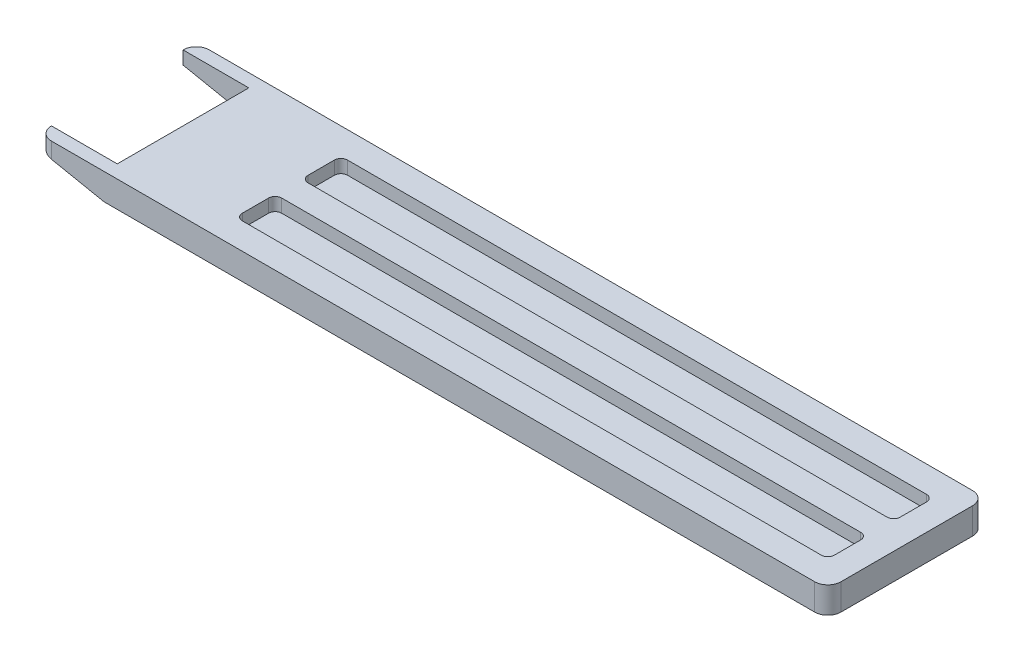
ISO-10303-21;
HEADER;
FILE_DESCRIPTION(('STEP AP214'),'2;1');
FILE_NAME('part.step','',(''),(''),'','','');
FILE_SCHEMA(('AUTOMOTIVE_DESIGN { 1 0 10303 214 1 1 1 1 }'));
ENDSEC;
DATA;
#1=APPLICATION_CONTEXT('core data for automotive mechanical design processes');
#2=APPLICATION_PROTOCOL_DEFINITION('international standard','automotive_design',2000,#1);
#3=PRODUCT_CONTEXT('',#1,'mechanical');
#4=PRODUCT('Part','Part','',(#3));
#5=PRODUCT_RELATED_PRODUCT_CATEGORY('part','',(#4));
#6=PRODUCT_DEFINITION_FORMATION('','',#4);
#7=PRODUCT_DEFINITION_CONTEXT('part definition',#1,'design');
#8=PRODUCT_DEFINITION('design','',#6,#7);
#9=PRODUCT_DEFINITION_SHAPE('','',#8);
#10=(LENGTH_UNIT() NAMED_UNIT(*) SI_UNIT(.MILLI.,.METRE.));
#11=(NAMED_UNIT(*) PLANE_ANGLE_UNIT() SI_UNIT($,.RADIAN.));
#12=(NAMED_UNIT(*) SI_UNIT($,.STERADIAN.) SOLID_ANGLE_UNIT());
#13=UNCERTAINTY_MEASURE_WITH_UNIT(LENGTH_MEASURE(1.E-05),#10,'distance_accuracy_value','');
#14=(GEOMETRIC_REPRESENTATION_CONTEXT(3) GLOBAL_UNCERTAINTY_ASSIGNED_CONTEXT((#13)) GLOBAL_UNIT_ASSIGNED_CONTEXT((#10,
#11,#12)) REPRESENTATION_CONTEXT('',''));
#15=CARTESIAN_POINT('',(0.,0.,0.));
#16=DIRECTION('',(0.,0.,1.));
#17=DIRECTION('',(1.,0.,0.));
#18=AXIS2_PLACEMENT_3D('',#15,#16,#17);
#19=CARTESIAN_POINT('',(-300.,10.,-60.001));
#20=DIRECTION('',(0.196116135138184,0.98058067569092,0.));
#21=DIRECTION('',(-0.98058067569092,0.196116135138184,0.));
#22=AXIS2_PLACEMENT_3D('',#19,#20,#21);
#23=PLANE('',#22);
#24=DIRECTION('',(0.,0.,1.));
#25=VECTOR('',#24,1.);
#26=CARTESIAN_POINT('',(-250.,0.,-60.001));
#27=LINE('',#26,#25);
#28=CARTESIAN_POINT('',(-250.,0.,-60.));
#29=VERTEX_POINT('',#28);
#30=CARTESIAN_POINT('',(-250.,0.,-50.));
#31=VERTEX_POINT('',#30);
#32=EDGE_CURVE('E404',#29,#31,#27,.T.);
#33=ORIENTED_EDGE('',*,*,#32,.T.);
#34=DIRECTION('',(0.98058067569092,-0.196116135138184,0.));
#35=VECTOR('',#34,1.);
#36=CARTESIAN_POINT('',(-298.076730769231,9.61534615384615,-49.9999999999999));
#37=LINE('',#36,#35);
#38=CARTESIAN_POINT('',(-300.,10.,-49.9999999999999));
#39=VERTEX_POINT('',#38);
#40=EDGE_CURVE('E237',#39,#31,#37,.T.);
#41=ORIENTED_EDGE('',*,*,#40,.F.);
#42=CARTESIAN_POINT('',(-290.,8.,-50.));
#43=DIRECTION('',(0.196116135138184,0.98058067569092,0.));
#44=DIRECTION('',(0.98058067569092,-0.196116135138184,0.));
#45=AXIS2_PLACEMENT_3D('',#42,#43,#44);
#46=ELLIPSE('',#45,10.1980390271856,10.);
#47=CARTESIAN_POINT('',(-290.,8.,-60.));
#48=VERTEX_POINT('',#47);
#49=EDGE_CURVE('E425',#39,#48,#46,.F.);
#50=ORIENTED_EDGE('',*,*,#49,.T.);
#51=DIRECTION('',(0.98058067569092,-0.196116135138184,0.));
#52=VECTOR('',#51,1.);
#53=CARTESIAN_POINT('',(-300.,10.,-60.));
#54=LINE('',#53,#52);
#55=EDGE_CURVE('E368',#48,#29,#54,.T.);
#56=ORIENTED_EDGE('',*,*,#55,.T.);
#57=EDGE_LOOP('',(#33,#41,#50,#56));
#58=FACE_BOUND('',#57,.T.);
#59=ADVANCED_FACE('F36',(#58),#23,.F.);
#60=CARTESIAN_POINT('',(300.,20.,60.));
#61=DIRECTION('',(0.,0.,-1.));
#62=DIRECTION('',(-1.,0.,0.));
#63=AXIS2_PLACEMENT_3D('',#60,#61,#62);
#64=PLANE('',#63);
#65=DIRECTION('',(1.,0.,0.));
#66=VECTOR('',#65,1.);
#67=CARTESIAN_POINT('',(300.,20.,60.));
#68=LINE('',#67,#66);
#69=CARTESIAN_POINT('',(-290.,20.,60.));
#70=VERTEX_POINT('',#69);
#71=CARTESIAN_POINT('',(290.,20.,60.));
#72=VERTEX_POINT('',#71);
#73=EDGE_CURVE('E408',#70,#72,#68,.T.);
#74=ORIENTED_EDGE('',*,*,#73,.F.);
#75=DIRECTION('',(0.,-1.,0.));
#76=VECTOR('',#75,1.);
#77=CARTESIAN_POINT('',(-290.,20.,60.));
#78=LINE('',#77,#76);
#79=CARTESIAN_POINT('',(-290.,8.,60.));
#80=VERTEX_POINT('',#79);
#81=EDGE_CURVE('E242',#70,#80,#78,.T.);
#82=ORIENTED_EDGE('',*,*,#81,.T.);
#83=DIRECTION('',(-0.98058067569092,0.196116135138184,0.));
#84=VECTOR('',#83,1.);
#85=CARTESIAN_POINT('',(-300.,10.,60.));
#86=LINE('',#85,#84);
#87=CARTESIAN_POINT('',(-250.,0.,60.));
#88=VERTEX_POINT('',#87);
#89=EDGE_CURVE('E400',#88,#80,#86,.T.);
#90=ORIENTED_EDGE('',*,*,#89,.F.);
#91=DIRECTION('',(1.,0.,0.));
#92=VECTOR('',#91,1.);
#93=CARTESIAN_POINT('',(300.,0.,60.));
#94=LINE('',#93,#92);
#95=CARTESIAN_POINT('',(290.,0.,60.));
#96=VERTEX_POINT('',#95);
#97=EDGE_CURVE('E407',#88,#96,#94,.T.);
#98=ORIENTED_EDGE('',*,*,#97,.T.);
#99=DIRECTION('',(0.,-1.,0.));
#100=VECTOR('',#99,1.);
#101=CARTESIAN_POINT('',(290.,20.,60.));
#102=LINE('',#101,#100);
#103=EDGE_CURVE('E247',#96,#72,#102,.F.);
#104=ORIENTED_EDGE('',*,*,#103,.T.);
#105=EDGE_LOOP('',(#74,#82,#90,#98,#104));
#106=FACE_BOUND('',#105,.T.);
#107=ADVANCED_FACE('F449',(#106),#64,.F.);
#108=CARTESIAN_POINT('',(300.,20.,60.));
#109=DIRECTION('',(-1.,0.,0.));
#110=DIRECTION('',(0.,0.,1.));
#111=AXIS2_PLACEMENT_3D('',#108,#109,#110);
#112=PLANE('',#111);
#113=DIRECTION('',(0.,0.,-1.));
#114=VECTOR('',#113,1.);
#115=CARTESIAN_POINT('',(300.,0.,60.));
#116=LINE('',#115,#114);
#117=CARTESIAN_POINT('',(300.,0.,50.));
#118=VERTEX_POINT('',#117);
#119=CARTESIAN_POINT('',(300.,0.,-50.));
#120=VERTEX_POINT('',#119);
#121=EDGE_CURVE('E418',#118,#120,#116,.T.);
#122=ORIENTED_EDGE('',*,*,#121,.T.);
#123=DIRECTION('',(0.,-1.,0.));
#124=VECTOR('',#123,1.);
#125=CARTESIAN_POINT('',(300.,20.,-50.));
#126=LINE('',#125,#124);
#127=CARTESIAN_POINT('',(300.,20.,-50.));
#128=VERTEX_POINT('',#127);
#129=EDGE_CURVE('E262',#120,#128,#126,.F.);
#130=ORIENTED_EDGE('',*,*,#129,.T.);
#131=DIRECTION('',(0.,0.,-1.));
#132=VECTOR('',#131,1.);
#133=CARTESIAN_POINT('',(300.,20.,60.));
#134=LINE('',#133,#132);
#135=CARTESIAN_POINT('',(300.,20.,50.));
#136=VERTEX_POINT('',#135);
#137=EDGE_CURVE('E410',#136,#128,#134,.T.);
#138=ORIENTED_EDGE('',*,*,#137,.F.);
#139=DIRECTION('',(0.,-1.,0.));
#140=VECTOR('',#139,1.);
#141=CARTESIAN_POINT('',(300.,20.,50.));
#142=LINE('',#141,#140);
#143=EDGE_CURVE('E259',#136,#118,#142,.T.);
#144=ORIENTED_EDGE('',*,*,#143,.T.);
#145=EDGE_LOOP('',(#122,#130,#138,#144));
#146=FACE_BOUND('',#145,.T.);
#147=ADVANCED_FACE('F438',(#146),#112,.F.);
#148=CARTESIAN_POINT('',(300.,20.,-60.));
#149=DIRECTION('',(0.,0.,1.));
#150=DIRECTION('',(1.,0.,0.));
#151=AXIS2_PLACEMENT_3D('',#148,#149,#150);
#152=PLANE('',#151);
#153=ORIENTED_EDGE('',*,*,#55,.F.);
#154=DIRECTION('',(0.,-1.,0.));
#155=VECTOR('',#154,1.);
#156=CARTESIAN_POINT('',(-290.,20.,-60.));
#157=LINE('',#156,#155);
#158=CARTESIAN_POINT('',(-290.,20.,-60.));
#159=VERTEX_POINT('',#158);
#160=EDGE_CURVE('E430',#48,#159,#157,.F.);
#161=ORIENTED_EDGE('',*,*,#160,.T.);
#162=DIRECTION('',(-1.,0.,0.));
#163=VECTOR('',#162,1.);
#164=CARTESIAN_POINT('',(300.,20.,-60.));
#165=LINE('',#164,#163);
#166=CARTESIAN_POINT('',(290.,20.,-60.));
#167=VERTEX_POINT('',#166);
#168=EDGE_CURVE('E226',#167,#159,#165,.T.);
#169=ORIENTED_EDGE('',*,*,#168,.F.);
#170=DIRECTION('',(0.,-1.,0.));
#171=VECTOR('',#170,1.);
#172=CARTESIAN_POINT('',(290.,20.,-60.));
#173=LINE('',#172,#171);
#174=CARTESIAN_POINT('',(290.,0.,-60.));
#175=VERTEX_POINT('',#174);
#176=EDGE_CURVE('E427',#167,#175,#173,.T.);
#177=ORIENTED_EDGE('',*,*,#176,.T.);
#178=DIRECTION('',(-1.,0.,0.));
#179=VECTOR('',#178,1.);
#180=CARTESIAN_POINT('',(300.,0.,-60.));
#181=LINE('',#180,#179);
#182=EDGE_CURVE('E411',#175,#29,#181,.T.);
#183=ORIENTED_EDGE('',*,*,#182,.T.);
#184=EDGE_LOOP('',(#153,#161,#169,#177,#183));
#185=FACE_BOUND('',#184,.T.);
#186=ADVANCED_FACE('F465',(#185),#152,.F.);
#187=CARTESIAN_POINT('',(0.,20.,0.));
#188=DIRECTION('',(0.,1.,0.));
#189=DIRECTION('',(0.,0.,1.));
#190=AXIS2_PLACEMENT_3D('',#187,#188,#189);
#191=PLANE('',#190);
#192=DIRECTION('',(-1.,0.,0.));
#193=VECTOR('',#192,1.);
#194=CARTESIAN_POINT('',(-300.,20.,-49.9999999999999));
#195=LINE('',#194,#193);
#196=CARTESIAN_POINT('',(-250.,20.,-50.));
#197=VERTEX_POINT('',#196);
#198=CARTESIAN_POINT('',(-300.,20.,-49.9999999999999));
#199=VERTEX_POINT('',#198);
#200=EDGE_CURVE('E471',#197,#199,#195,.T.);
#201=ORIENTED_EDGE('',*,*,#200,.F.);
#202=DIRECTION('',(0.,0.,-1.));
#203=VECTOR('',#202,1.);
#204=CARTESIAN_POINT('',(-250.,20.,-50.));
#205=LINE('',#204,#203);
#206=CARTESIAN_POINT('',(-250.,20.,50.0000000000001));
#207=VERTEX_POINT('',#206);
#208=EDGE_CURVE('E236',#207,#197,#205,.T.);
#209=ORIENTED_EDGE('',*,*,#208,.F.);
#210=DIRECTION('',(1.,0.,0.));
#211=VECTOR('',#210,1.);
#212=CARTESIAN_POINT('',(-300.,20.,50.));
#213=LINE('',#212,#211);
#214=CARTESIAN_POINT('',(-300.,20.,50.));
#215=VERTEX_POINT('',#214);
#216=EDGE_CURVE('E218',#215,#207,#213,.T.);
#217=ORIENTED_EDGE('',*,*,#216,.F.);
#218=CARTESIAN_POINT('',(-290.,20.,50.));
#219=DIRECTION('',(0.,1.,0.));
#220=DIRECTION('',(0.,0.,1.));
#221=AXIS2_PLACEMENT_3D('',#218,#219,#220);
#222=CIRCLE('',#221,10.);
#223=EDGE_CURVE('E233',#215,#70,#222,.T.);
#224=ORIENTED_EDGE('',*,*,#223,.T.);
#225=ORIENTED_EDGE('',*,*,#73,.T.);
#226=CARTESIAN_POINT('',(290.,20.,50.));
#227=DIRECTION('',(0.,1.,0.));
#228=DIRECTION('',(0.,0.,1.));
#229=AXIS2_PLACEMENT_3D('',#226,#227,#228);
#230=CIRCLE('',#229,10.);
#231=EDGE_CURVE('E249',#72,#136,#230,.T.);
#232=ORIENTED_EDGE('',*,*,#231,.T.);
#233=ORIENTED_EDGE('',*,*,#137,.T.);
#234=CARTESIAN_POINT('',(290.,20.,-50.));
#235=DIRECTION('',(0.,1.,0.));
#236=DIRECTION('',(0.,0.,1.));
#237=AXIS2_PLACEMENT_3D('',#234,#235,#236);
#238=CIRCLE('',#237,10.);
#239=EDGE_CURVE('E244',#128,#167,#238,.T.);
#240=ORIENTED_EDGE('',*,*,#239,.T.);
#241=ORIENTED_EDGE('',*,*,#168,.T.);
#242=CARTESIAN_POINT('',(-290.,20.,-50.));
#243=DIRECTION('',(0.,1.,0.));
#244=DIRECTION('',(0.,0.,1.));
#245=AXIS2_PLACEMENT_3D('',#242,#243,#244);
#246=CIRCLE('',#245,10.);
#247=EDGE_CURVE('E243',#159,#199,#246,.T.);
#248=ORIENTED_EDGE('',*,*,#247,.T.);
#249=EDGE_LOOP('',(#201,#209,#217,#224,#225,#232,#233,#240,#241,#248));
#250=FACE_BOUND('',#249,.T.);
#251=DIRECTION('',(0.,0.,1.));
#252=VECTOR('',#251,1.);
#253=CARTESIAN_POINT('',(-170.,20.,-40.));
#254=LINE('',#253,#252);
#255=CARTESIAN_POINT('',(-170.,20.,-35.));
#256=VERTEX_POINT('',#255);
#257=CARTESIAN_POINT('',(-170.,20.,-15.));
#258=VERTEX_POINT('',#257);
#259=EDGE_CURVE('E334',#256,#258,#254,.T.);
#260=ORIENTED_EDGE('',*,*,#259,.F.);
#261=CARTESIAN_POINT('',(-165.,20.,-35.));
#262=DIRECTION('',(0.,1.,0.));
#263=DIRECTION('',(0.,0.,1.));
#264=AXIS2_PLACEMENT_3D('',#261,#262,#263);
#265=CIRCLE('',#264,5.);
#266=CARTESIAN_POINT('',(-165.,20.,-40.));
#267=VERTEX_POINT('',#266);
#268=EDGE_CURVE('E44',#256,#267,#265,.F.);
#269=ORIENTED_EDGE('',*,*,#268,.T.);
#270=DIRECTION('',(-1.,0.,0.));
#271=VECTOR('',#270,1.);
#272=CARTESIAN_POINT('',(-170.,20.,-40.));
#273=LINE('',#272,#271);
#274=CARTESIAN_POINT('',(275.,20.,-40.));
#275=VERTEX_POINT('',#274);
#276=EDGE_CURVE('E332',#275,#267,#273,.T.);
#277=ORIENTED_EDGE('',*,*,#276,.F.);
#278=CARTESIAN_POINT('',(275.,20.,-35.));
#279=DIRECTION('',(0.,1.,0.));
#280=DIRECTION('',(0.,0.,1.));
#281=AXIS2_PLACEMENT_3D('',#278,#279,#280);
#282=CIRCLE('',#281,5.);
#283=CARTESIAN_POINT('',(280.,20.,-35.));
#284=VERTEX_POINT('',#283);
#285=EDGE_CURVE('E325',#275,#284,#282,.F.);
#286=ORIENTED_EDGE('',*,*,#285,.T.);
#287=DIRECTION('',(0.,0.,-1.));
#288=VECTOR('',#287,1.);
#289=CARTESIAN_POINT('',(280.,20.,-40.));
#290=LINE('',#289,#288);
#291=CARTESIAN_POINT('',(280.,20.,-15.));
#292=VERTEX_POINT('',#291);
#293=EDGE_CURVE('E344',#292,#284,#290,.T.);
#294=ORIENTED_EDGE('',*,*,#293,.F.);
#295=CARTESIAN_POINT('',(275.,20.,-15.));
#296=DIRECTION('',(0.,1.,0.));
#297=DIRECTION('',(0.,0.,1.));
#298=AXIS2_PLACEMENT_3D('',#295,#296,#297);
#299=CIRCLE('',#298,5.);
#300=CARTESIAN_POINT('',(275.,20.,-10.));
#301=VERTEX_POINT('',#300);
#302=EDGE_CURVE('E323',#292,#301,#299,.F.);
#303=ORIENTED_EDGE('',*,*,#302,.T.);
#304=DIRECTION('',(1.,0.,0.));
#305=VECTOR('',#304,1.);
#306=CARTESIAN_POINT('',(-170.,20.,-10.));
#307=LINE('',#306,#305);
#308=CARTESIAN_POINT('',(-165.,20.,-10.));
#309=VERTEX_POINT('',#308);
#310=EDGE_CURVE('E370',#309,#301,#307,.T.);
#311=ORIENTED_EDGE('',*,*,#310,.F.);
#312=CARTESIAN_POINT('',(-165.,20.,-15.));
#313=DIRECTION('',(0.,1.,0.));
#314=DIRECTION('',(0.,0.,1.));
#315=AXIS2_PLACEMENT_3D('',#312,#313,#314);
#316=CIRCLE('',#315,5.);
#317=EDGE_CURVE('E327',#309,#258,#316,.F.);
#318=ORIENTED_EDGE('',*,*,#317,.T.);
#319=EDGE_LOOP('',(#260,#269,#277,#286,#294,#303,#311,#318));
#320=FACE_BOUND('',#319,.T.);
#321=DIRECTION('',(0.,0.,1.));
#322=VECTOR('',#321,1.);
#323=CARTESIAN_POINT('',(-170.,20.,10.));
#324=LINE('',#323,#322);
#325=CARTESIAN_POINT('',(-170.,20.,15.0000000000001));
#326=VERTEX_POINT('',#325);
#327=CARTESIAN_POINT('',(-170.,20.,35.));
#328=VERTEX_POINT('',#327);
#329=EDGE_CURVE('E388',#326,#328,#324,.T.);
#330=ORIENTED_EDGE('',*,*,#329,.F.);
#331=CARTESIAN_POINT('',(-165.,20.,15.0000000000001));
#332=DIRECTION('',(0.,1.,0.));
#333=DIRECTION('',(0.,0.,1.));
#334=AXIS2_PLACEMENT_3D('',#331,#332,#333);
#335=CIRCLE('',#334,5.);
#336=CARTESIAN_POINT('',(-165.,20.,10.));
#337=VERTEX_POINT('',#336);
#338=EDGE_CURVE('E11',#326,#337,#335,.F.);
#339=ORIENTED_EDGE('',*,*,#338,.T.);
#340=DIRECTION('',(-1.,0.,0.));
#341=VECTOR('',#340,1.);
#342=CARTESIAN_POINT('',(-170.,20.,10.));
#343=LINE('',#342,#341);
#344=CARTESIAN_POINT('',(275.,20.,10.));
#345=VERTEX_POINT('',#344);
#346=EDGE_CURVE('E380',#345,#337,#343,.T.);
#347=ORIENTED_EDGE('',*,*,#346,.F.);
#348=CARTESIAN_POINT('',(275.,20.,15.0000000000001));
#349=DIRECTION('',(0.,1.,0.));
#350=DIRECTION('',(0.,0.,1.));
#351=AXIS2_PLACEMENT_3D('',#348,#349,#350);
#352=CIRCLE('',#351,5.);
#353=CARTESIAN_POINT('',(280.,20.,15.0000000000001));
#354=VERTEX_POINT('',#353);
#355=EDGE_CURVE('E319',#345,#354,#352,.F.);
#356=ORIENTED_EDGE('',*,*,#355,.T.);
#357=DIRECTION('',(0.,0.,-1.));
#358=VECTOR('',#357,1.);
#359=CARTESIAN_POINT('',(280.,20.,10.));
#360=LINE('',#359,#358);
#361=CARTESIAN_POINT('',(280.,20.,35.));
#362=VERTEX_POINT('',#361);
#363=EDGE_CURVE('E393',#362,#354,#360,.T.);
#364=ORIENTED_EDGE('',*,*,#363,.F.);
#365=CARTESIAN_POINT('',(275.,20.,35.));
#366=DIRECTION('',(0.,1.,0.));
#367=DIRECTION('',(0.,0.,1.));
#368=AXIS2_PLACEMENT_3D('',#365,#366,#367);
#369=CIRCLE('',#368,5.);
#370=CARTESIAN_POINT('',(275.,20.,40.));
#371=VERTEX_POINT('',#370);
#372=EDGE_CURVE('E321',#362,#371,#369,.F.);
#373=ORIENTED_EDGE('',*,*,#372,.T.);
#374=DIRECTION('',(1.,0.,0.));
#375=VECTOR('',#374,1.);
#376=CARTESIAN_POINT('',(-170.,20.,40.));
#377=LINE('',#376,#375);
#378=CARTESIAN_POINT('',(-165.,20.,40.));
#379=VERTEX_POINT('',#378);
#380=EDGE_CURVE('E390',#379,#371,#377,.T.);
#381=ORIENTED_EDGE('',*,*,#380,.F.);
#382=CARTESIAN_POINT('',(-165.,20.,35.));
#383=DIRECTION('',(0.,1.,0.));
#384=DIRECTION('',(0.,0.,1.));
#385=AXIS2_PLACEMENT_3D('',#382,#383,#384);
#386=CIRCLE('',#385,5.);
#387=EDGE_CURVE('E51',#379,#328,#386,.F.);
#388=ORIENTED_EDGE('',*,*,#387,.T.);
#389=EDGE_LOOP('',(#330,#339,#347,#356,#364,#373,#381,#388));
#390=FACE_BOUND('',#389,.T.);
#391=ADVANCED_FACE('F230',(#250,#320,#390),#191,.T.);
#392=CARTESIAN_POINT('',(0.,0.,0.));
#393=DIRECTION('',(0.,1.,0.));
#394=DIRECTION('',(0.,0.,1.));
#395=AXIS2_PLACEMENT_3D('',#392,#393,#394);
#396=PLANE('',#395);
#397=ORIENTED_EDGE('',*,*,#182,.F.);
#398=CARTESIAN_POINT('',(290.,0.,-50.));
#399=DIRECTION('',(0.,1.,0.));
#400=DIRECTION('',(0.,0.,1.));
#401=AXIS2_PLACEMENT_3D('',#398,#399,#400);
#402=CIRCLE('',#401,10.);
#403=EDGE_CURVE('E257',#175,#120,#402,.F.);
#404=ORIENTED_EDGE('',*,*,#403,.T.);
#405=ORIENTED_EDGE('',*,*,#121,.F.);
#406=CARTESIAN_POINT('',(290.,0.,50.));
#407=DIRECTION('',(0.,1.,0.));
#408=DIRECTION('',(0.,0.,1.));
#409=AXIS2_PLACEMENT_3D('',#406,#407,#408);
#410=CIRCLE('',#409,10.);
#411=EDGE_CURVE('E255',#118,#96,#410,.F.);
#412=ORIENTED_EDGE('',*,*,#411,.T.);
#413=ORIENTED_EDGE('',*,*,#97,.F.);
#414=CARTESIAN_POINT('',(-250.,0.,50.0000000000001));
#415=VERTEX_POINT('',#414);
#416=EDGE_CURVE('E403',#415,#88,#27,.T.);
#417=ORIENTED_EDGE('',*,*,#416,.F.);
#418=DIRECTION('',(0.,0.,1.));
#419=VECTOR('',#418,1.);
#420=CARTESIAN_POINT('',(-250.,0.,-60.001));
#421=LINE('',#420,#419);
#422=EDGE_CURVE('E455',#31,#415,#421,.T.);
#423=ORIENTED_EDGE('',*,*,#422,.F.);
#424=ORIENTED_EDGE('',*,*,#32,.F.);
#425=EDGE_LOOP('',(#397,#404,#405,#412,#413,#417,#423,#424));
#426=FACE_BOUND('',#425,.T.);
#427=ADVANCED_FACE('F445',(#426),#396,.F.);
#428=CARTESIAN_POINT('',(-290.,8.,50.));
#429=DIRECTION('',(0.196116135138184,0.98058067569092,0.));
#430=DIRECTION('',(0.98058067569092,-0.196116135138184,0.));
#431=AXIS2_PLACEMENT_3D('',#428,#429,#430);
#432=ELLIPSE('',#431,10.1980390271856,10.);
#433=CARTESIAN_POINT('',(-300.,10.,50.));
#434=VERTEX_POINT('',#433);
#435=EDGE_CURVE('E423',#80,#434,#432,.F.);
#436=ORIENTED_EDGE('',*,*,#435,.T.);
#437=DIRECTION('',(-0.98058067569092,0.196116135138184,0.));
#438=VECTOR('',#437,1.);
#439=CARTESIAN_POINT('',(-298.076730769231,9.61534615384615,50.));
#440=LINE('',#439,#438);
#441=EDGE_CURVE('E221',#415,#434,#440,.T.);
#442=ORIENTED_EDGE('',*,*,#441,.F.);
#443=ORIENTED_EDGE('',*,*,#416,.T.);
#444=ORIENTED_EDGE('',*,*,#89,.T.);
#445=EDGE_LOOP('',(#436,#442,#443,#444));
#446=FACE_BOUND('',#445,.T.);
#447=ADVANCED_FACE('F451',(#446),#23,.F.);
#448=CARTESIAN_POINT('',(-170.,10.,10.));
#449=DIRECTION('',(-1.,0.,0.));
#450=DIRECTION('',(0.,0.,1.));
#451=AXIS2_PLACEMENT_3D('',#448,#449,#450);
#452=PLANE('',#451);
#453=ORIENTED_EDGE('',*,*,#329,.T.);
#454=DIRECTION('',(0.,1.,0.));
#455=VECTOR('',#454,1.);
#456=CARTESIAN_POINT('',(-170.,10.,35.));
#457=LINE('',#456,#455);
#458=CARTESIAN_POINT('',(-170.,10.,35.));
#459=VERTEX_POINT('',#458);
#460=EDGE_CURVE('E317',#328,#459,#457,.F.);
#461=ORIENTED_EDGE('',*,*,#460,.T.);
#462=DIRECTION('',(0.,0.,1.));
#463=VECTOR('',#462,1.);
#464=CARTESIAN_POINT('',(-170.,10.,10.));
#465=LINE('',#464,#463);
#466=CARTESIAN_POINT('',(-170.,10.,15.0000000000001));
#467=VERTEX_POINT('',#466);
#468=EDGE_CURVE('E376',#467,#459,#465,.T.);
#469=ORIENTED_EDGE('',*,*,#468,.F.);
#470=DIRECTION('',(0.,1.,0.));
#471=VECTOR('',#470,1.);
#472=CARTESIAN_POINT('',(-170.,20.,15.0000000000001));
#473=LINE('',#472,#471);
#474=EDGE_CURVE('E315',#467,#326,#473,.T.);
#475=ORIENTED_EDGE('',*,*,#474,.T.);
#476=EDGE_LOOP('',(#453,#461,#469,#475));
#477=FACE_BOUND('',#476,.T.);
#478=ADVANCED_FACE('F493',(#477),#452,.F.);
#479=CARTESIAN_POINT('',(-170.,10.,10.));
#480=DIRECTION('',(0.,0.,-1.));
#481=DIRECTION('',(-1.,0.,0.));
#482=AXIS2_PLACEMENT_3D('',#479,#480,#481);
#483=PLANE('',#482);
#484=DIRECTION('',(-1.,0.,0.));
#485=VECTOR('',#484,1.);
#486=CARTESIAN_POINT('',(-170.,10.,10.));
#487=LINE('',#486,#485);
#488=CARTESIAN_POINT('',(275.,10.,10.));
#489=VERTEX_POINT('',#488);
#490=CARTESIAN_POINT('',(-165.,10.,10.));
#491=VERTEX_POINT('',#490);
#492=EDGE_CURVE('E371',#489,#491,#487,.T.);
#493=ORIENTED_EDGE('',*,*,#492,.F.);
#494=DIRECTION('',(0.,1.,0.));
#495=VECTOR('',#494,1.);
#496=CARTESIAN_POINT('',(275.,20.,10.));
#497=LINE('',#496,#495);
#498=EDGE_CURVE('E266',#489,#345,#497,.T.);
#499=ORIENTED_EDGE('',*,*,#498,.T.);
#500=ORIENTED_EDGE('',*,*,#346,.T.);
#501=DIRECTION('',(0.,1.,0.));
#502=VECTOR('',#501,1.);
#503=CARTESIAN_POINT('',(-165.,10.,10.));
#504=LINE('',#503,#502);
#505=EDGE_CURVE('E264',#337,#491,#504,.F.);
#506=ORIENTED_EDGE('',*,*,#505,.T.);
#507=EDGE_LOOP('',(#493,#499,#500,#506));
#508=FACE_BOUND('',#507,.T.);
#509=ADVANCED_FACE('F498',(#508),#483,.F.);
#510=CARTESIAN_POINT('',(280.,10.,10.));
#511=DIRECTION('',(1.,0.,0.));
#512=DIRECTION('',(0.,0.,-1.));
#513=AXIS2_PLACEMENT_3D('',#510,#511,#512);
#514=PLANE('',#513);
#515=ORIENTED_EDGE('',*,*,#363,.T.);
#516=DIRECTION('',(0.,1.,0.));
#517=VECTOR('',#516,1.);
#518=CARTESIAN_POINT('',(280.,10.,15.0000000000001));
#519=LINE('',#518,#517);
#520=CARTESIAN_POINT('',(280.,10.,15.0000000000001));
#521=VERTEX_POINT('',#520);
#522=EDGE_CURVE('E272',#354,#521,#519,.F.);
#523=ORIENTED_EDGE('',*,*,#522,.T.);
#524=DIRECTION('',(0.,0.,-1.));
#525=VECTOR('',#524,1.);
#526=CARTESIAN_POINT('',(280.,10.,10.));
#527=LINE('',#526,#525);
#528=CARTESIAN_POINT('',(280.,10.,35.));
#529=VERTEX_POINT('',#528);
#530=EDGE_CURVE('E383',#529,#521,#527,.T.);
#531=ORIENTED_EDGE('',*,*,#530,.F.);
#532=DIRECTION('',(0.,1.,0.));
#533=VECTOR('',#532,1.);
#534=CARTESIAN_POINT('',(280.,20.,35.));
#535=LINE('',#534,#533);
#536=EDGE_CURVE('E269',#529,#362,#535,.T.);
#537=ORIENTED_EDGE('',*,*,#536,.T.);
#538=EDGE_LOOP('',(#515,#523,#531,#537));
#539=FACE_BOUND('',#538,.T.);
#540=ADVANCED_FACE('F538',(#539),#514,.F.);
#541=CARTESIAN_POINT('',(-170.,10.,40.));
#542=DIRECTION('',(0.,0.,1.));
#543=DIRECTION('',(1.,0.,0.));
#544=AXIS2_PLACEMENT_3D('',#541,#542,#543);
#545=PLANE('',#544);
#546=ORIENTED_EDGE('',*,*,#380,.T.);
#547=DIRECTION('',(0.,1.,0.));
#548=VECTOR('',#547,1.);
#549=CARTESIAN_POINT('',(275.,10.,40.));
#550=LINE('',#549,#548);
#551=CARTESIAN_POINT('',(275.,10.,40.));
#552=VERTEX_POINT('',#551);
#553=EDGE_CURVE('E285',#371,#552,#550,.F.);
#554=ORIENTED_EDGE('',*,*,#553,.T.);
#555=DIRECTION('',(1.,0.,0.));
#556=VECTOR('',#555,1.);
#557=CARTESIAN_POINT('',(-170.,10.,40.));
#558=LINE('',#557,#556);
#559=CARTESIAN_POINT('',(-165.,10.,40.));
#560=VERTEX_POINT('',#559);
#561=EDGE_CURVE('E379',#560,#552,#558,.T.);
#562=ORIENTED_EDGE('',*,*,#561,.F.);
#563=DIRECTION('',(0.,1.,0.));
#564=VECTOR('',#563,1.);
#565=CARTESIAN_POINT('',(-165.,20.,40.));
#566=LINE('',#565,#564);
#567=EDGE_CURVE('E282',#560,#379,#566,.T.);
#568=ORIENTED_EDGE('',*,*,#567,.T.);
#569=EDGE_LOOP('',(#546,#554,#562,#568));
#570=FACE_BOUND('',#569,.T.);
#571=ADVANCED_FACE('F534',(#570),#545,.F.);
#572=CARTESIAN_POINT('',(0.,10.,0.));
#573=DIRECTION('',(0.,1.,0.));
#574=DIRECTION('',(0.,0.,1.));
#575=AXIS2_PLACEMENT_3D('',#572,#573,#574);
#576=PLANE('',#575);
#577=ORIENTED_EDGE('',*,*,#530,.T.);
#578=CARTESIAN_POINT('',(275.,10.,15.0000000000001));
#579=DIRECTION('',(0.,1.,0.));
#580=DIRECTION('',(0.,0.,1.));
#581=AXIS2_PLACEMENT_3D('',#578,#579,#580);
#582=CIRCLE('',#581,5.);
#583=EDGE_CURVE('E280',#521,#489,#582,.T.);
#584=ORIENTED_EDGE('',*,*,#583,.T.);
#585=ORIENTED_EDGE('',*,*,#492,.T.);
#586=CARTESIAN_POINT('',(-165.,10.,15.0000000000001));
#587=DIRECTION('',(0.,1.,0.));
#588=DIRECTION('',(0.,0.,1.));
#589=AXIS2_PLACEMENT_3D('',#586,#587,#588);
#590=CIRCLE('',#589,5.);
#591=EDGE_CURVE('E274',#491,#467,#590,.T.);
#592=ORIENTED_EDGE('',*,*,#591,.T.);
#593=ORIENTED_EDGE('',*,*,#468,.T.);
#594=CARTESIAN_POINT('',(-165.,10.,35.));
#595=DIRECTION('',(0.,1.,0.));
#596=DIRECTION('',(0.,0.,1.));
#597=AXIS2_PLACEMENT_3D('',#594,#595,#596);
#598=CIRCLE('',#597,5.);
#599=EDGE_CURVE('E276',#459,#560,#598,.T.);
#600=ORIENTED_EDGE('',*,*,#599,.T.);
#601=ORIENTED_EDGE('',*,*,#561,.T.);
#602=CARTESIAN_POINT('',(275.,10.,35.));
#603=DIRECTION('',(0.,1.,0.));
#604=DIRECTION('',(0.,0.,1.));
#605=AXIS2_PLACEMENT_3D('',#602,#603,#604);
#606=CIRCLE('',#605,5.);
#607=EDGE_CURVE('E278',#552,#529,#606,.T.);
#608=ORIENTED_EDGE('',*,*,#607,.T.);
#609=EDGE_LOOP('',(#577,#584,#585,#592,#593,#600,#601,#608));
#610=FACE_BOUND('',#609,.T.);
#611=ADVANCED_FACE('F531',(#610),#576,.T.);
#612=CARTESIAN_POINT('',(-170.,10.,-40.));
#613=DIRECTION('',(-1.,0.,0.));
#614=DIRECTION('',(0.,0.,1.));
#615=AXIS2_PLACEMENT_3D('',#612,#613,#614);
#616=PLANE('',#615);
#617=ORIENTED_EDGE('',*,*,#259,.T.);
#618=DIRECTION('',(0.,1.,0.));
#619=VECTOR('',#618,1.);
#620=CARTESIAN_POINT('',(-170.,10.,-15.));
#621=LINE('',#620,#619);
#622=CARTESIAN_POINT('',(-170.,10.,-15.));
#623=VERTEX_POINT('',#622);
#624=EDGE_CURVE('E313',#258,#623,#621,.F.);
#625=ORIENTED_EDGE('',*,*,#624,.T.);
#626=DIRECTION('',(0.,0.,1.));
#627=VECTOR('',#626,1.);
#628=CARTESIAN_POINT('',(-170.,10.,-40.));
#629=LINE('',#628,#627);
#630=CARTESIAN_POINT('',(-170.,10.,-35.));
#631=VERTEX_POINT('',#630);
#632=EDGE_CURVE('E343',#631,#623,#629,.T.);
#633=ORIENTED_EDGE('',*,*,#632,.F.);
#634=DIRECTION('',(0.,1.,0.));
#635=VECTOR('',#634,1.);
#636=CARTESIAN_POINT('',(-170.,20.,-35.));
#637=LINE('',#636,#635);
#638=EDGE_CURVE('E310',#631,#256,#637,.T.);
#639=ORIENTED_EDGE('',*,*,#638,.T.);
#640=EDGE_LOOP('',(#617,#625,#633,#639));
#641=FACE_BOUND('',#640,.T.);
#642=ADVANCED_FACE('F356',(#641),#616,.F.);
#643=CARTESIAN_POINT('',(-170.,10.,-40.));
#644=DIRECTION('',(0.,0.,-1.));
#645=DIRECTION('',(-1.,0.,0.));
#646=AXIS2_PLACEMENT_3D('',#643,#644,#645);
#647=PLANE('',#646);
#648=DIRECTION('',(-1.,0.,0.));
#649=VECTOR('',#648,1.);
#650=CARTESIAN_POINT('',(-170.,10.,-40.));
#651=LINE('',#650,#649);
#652=CARTESIAN_POINT('',(275.,10.,-40.));
#653=VERTEX_POINT('',#652);
#654=CARTESIAN_POINT('',(-165.,10.,-40.));
#655=VERTEX_POINT('',#654);
#656=EDGE_CURVE('E354',#653,#655,#651,.T.);
#657=ORIENTED_EDGE('',*,*,#656,.F.);
#658=DIRECTION('',(0.,1.,0.));
#659=VECTOR('',#658,1.);
#660=CARTESIAN_POINT('',(275.,20.,-40.));
#661=LINE('',#660,#659);
#662=EDGE_CURVE('E307',#653,#275,#661,.T.);
#663=ORIENTED_EDGE('',*,*,#662,.T.);
#664=ORIENTED_EDGE('',*,*,#276,.T.);
#665=DIRECTION('',(0.,1.,0.));
#666=VECTOR('',#665,1.);
#667=CARTESIAN_POINT('',(-165.,10.,-40.));
#668=LINE('',#667,#666);
#669=EDGE_CURVE('E305',#267,#655,#668,.F.);
#670=ORIENTED_EDGE('',*,*,#669,.T.);
#671=EDGE_LOOP('',(#657,#663,#664,#670));
#672=FACE_BOUND('',#671,.T.);
#673=ADVANCED_FACE('F340',(#672),#647,.F.);
#674=CARTESIAN_POINT('',(280.,10.,-40.));
#675=DIRECTION('',(1.,0.,0.));
#676=DIRECTION('',(0.,0.,-1.));
#677=AXIS2_PLACEMENT_3D('',#674,#675,#676);
#678=PLANE('',#677);
#679=DIRECTION('',(0.,0.,-1.));
#680=VECTOR('',#679,1.);
#681=CARTESIAN_POINT('',(280.,10.,-40.));
#682=LINE('',#681,#680);
#683=CARTESIAN_POINT('',(280.,10.,-15.));
#684=VERTEX_POINT('',#683);
#685=CARTESIAN_POINT('',(280.,10.,-35.));
#686=VERTEX_POINT('',#685);
#687=EDGE_CURVE('E360',#684,#686,#682,.T.);
#688=ORIENTED_EDGE('',*,*,#687,.F.);
#689=DIRECTION('',(0.,1.,0.));
#690=VECTOR('',#689,1.);
#691=CARTESIAN_POINT('',(280.,20.,-15.));
#692=LINE('',#691,#690);
#693=EDGE_CURVE('E289',#684,#292,#692,.T.);
#694=ORIENTED_EDGE('',*,*,#693,.T.);
#695=ORIENTED_EDGE('',*,*,#293,.T.);
#696=DIRECTION('',(0.,1.,0.));
#697=VECTOR('',#696,1.);
#698=CARTESIAN_POINT('',(280.,10.,-35.));
#699=LINE('',#698,#697);
#700=EDGE_CURVE('E287',#284,#686,#699,.F.);
#701=ORIENTED_EDGE('',*,*,#700,.T.);
#702=EDGE_LOOP('',(#688,#694,#695,#701));
#703=FACE_BOUND('',#702,.T.);
#704=ADVANCED_FACE('F518',(#703),#678,.F.);
#705=CARTESIAN_POINT('',(-170.,10.,-10.));
#706=DIRECTION('',(0.,0.,1.));
#707=DIRECTION('',(1.,0.,0.));
#708=AXIS2_PLACEMENT_3D('',#705,#706,#707);
#709=PLANE('',#708);
#710=ORIENTED_EDGE('',*,*,#310,.T.);
#711=DIRECTION('',(0.,1.,0.));
#712=VECTOR('',#711,1.);
#713=CARTESIAN_POINT('',(275.,10.,-10.));
#714=LINE('',#713,#712);
#715=CARTESIAN_POINT('',(275.,10.,-10.));
#716=VERTEX_POINT('',#715);
#717=EDGE_CURVE('E295',#301,#716,#714,.F.);
#718=ORIENTED_EDGE('',*,*,#717,.T.);
#719=DIRECTION('',(1.,0.,0.));
#720=VECTOR('',#719,1.);
#721=CARTESIAN_POINT('',(-170.,10.,-10.));
#722=LINE('',#721,#720);
#723=CARTESIAN_POINT('',(-165.,10.,-10.));
#724=VERTEX_POINT('',#723);
#725=EDGE_CURVE('E358',#724,#716,#722,.T.);
#726=ORIENTED_EDGE('',*,*,#725,.F.);
#727=DIRECTION('',(0.,1.,0.));
#728=VECTOR('',#727,1.);
#729=CARTESIAN_POINT('',(-165.,20.,-10.));
#730=LINE('',#729,#728);
#731=EDGE_CURVE('E292',#724,#309,#730,.T.);
#732=ORIENTED_EDGE('',*,*,#731,.T.);
#733=EDGE_LOOP('',(#710,#718,#726,#732));
#734=FACE_BOUND('',#733,.T.);
#735=ADVANCED_FACE('F513',(#734),#709,.F.);
#736=CARTESIAN_POINT('',(0.,10.,0.));
#737=DIRECTION('',(0.,1.,0.));
#738=DIRECTION('',(0.,0.,1.));
#739=AXIS2_PLACEMENT_3D('',#736,#737,#738);
#740=PLANE('',#739);
#741=ORIENTED_EDGE('',*,*,#725,.T.);
#742=CARTESIAN_POINT('',(275.,10.,-15.));
#743=DIRECTION('',(0.,1.,0.));
#744=DIRECTION('',(0.,0.,1.));
#745=AXIS2_PLACEMENT_3D('',#742,#743,#744);
#746=CIRCLE('',#745,5.);
#747=EDGE_CURVE('E303',#716,#684,#746,.T.);
#748=ORIENTED_EDGE('',*,*,#747,.T.);
#749=ORIENTED_EDGE('',*,*,#687,.T.);
#750=CARTESIAN_POINT('',(275.,10.,-35.));
#751=DIRECTION('',(0.,1.,0.));
#752=DIRECTION('',(0.,0.,1.));
#753=AXIS2_PLACEMENT_3D('',#750,#751,#752);
#754=CIRCLE('',#753,5.);
#755=EDGE_CURVE('E301',#686,#653,#754,.T.);
#756=ORIENTED_EDGE('',*,*,#755,.T.);
#757=ORIENTED_EDGE('',*,*,#656,.T.);
#758=CARTESIAN_POINT('',(-165.,10.,-35.));
#759=DIRECTION('',(0.,1.,0.));
#760=DIRECTION('',(0.,0.,1.));
#761=AXIS2_PLACEMENT_3D('',#758,#759,#760);
#762=CIRCLE('',#761,5.);
#763=EDGE_CURVE('E297',#655,#631,#762,.T.);
#764=ORIENTED_EDGE('',*,*,#763,.T.);
#765=ORIENTED_EDGE('',*,*,#632,.T.);
#766=CARTESIAN_POINT('',(-165.,10.,-15.));
#767=DIRECTION('',(0.,1.,0.));
#768=DIRECTION('',(0.,0.,1.));
#769=AXIS2_PLACEMENT_3D('',#766,#767,#768);
#770=CIRCLE('',#769,5.);
#771=EDGE_CURVE('E299',#623,#724,#770,.T.);
#772=ORIENTED_EDGE('',*,*,#771,.T.);
#773=EDGE_LOOP('',(#741,#748,#749,#756,#757,#764,#765,#772));
#774=FACE_BOUND('',#773,.T.);
#775=ADVANCED_FACE('F352',(#774),#740,.T.);
#776=CARTESIAN_POINT('',(-290.,20.,-50.));
#777=DIRECTION('',(0.,-1.,0.));
#778=DIRECTION('',(0.,0.,-1.));
#779=AXIS2_PLACEMENT_3D('',#776,#777,#778);
#780=CYLINDRICAL_SURFACE('',#779,10.);
#781=ORIENTED_EDGE('',*,*,#247,.F.);
#782=ORIENTED_EDGE('',*,*,#160,.F.);
#783=ORIENTED_EDGE('',*,*,#49,.F.);
#784=DIRECTION('',(0.,-1.,0.));
#785=VECTOR('',#784,1.);
#786=CARTESIAN_POINT('',(-300.,20.,-50.));
#787=LINE('',#786,#785);
#788=EDGE_CURVE('E225',#199,#39,#787,.T.);
#789=ORIENTED_EDGE('',*,*,#788,.F.);
#790=EDGE_LOOP('',(#781,#782,#783,#789));
#791=FACE_BOUND('',#790,.T.);
#792=ADVANCED_FACE('F469',(#791),#780,.T.);
#793=CARTESIAN_POINT('',(-290.,20.,50.));
#794=DIRECTION('',(0.,-1.,0.));
#795=DIRECTION('',(0.,0.,-1.));
#796=AXIS2_PLACEMENT_3D('',#793,#794,#795);
#797=CYLINDRICAL_SURFACE('',#796,10.);
#798=ORIENTED_EDGE('',*,*,#223,.F.);
#799=DIRECTION('',(0.,-1.,0.));
#800=VECTOR('',#799,1.);
#801=CARTESIAN_POINT('',(-300.,20.,50.));
#802=LINE('',#801,#800);
#803=EDGE_CURVE('E215',#434,#215,#802,.F.);
#804=ORIENTED_EDGE('',*,*,#803,.F.);
#805=ORIENTED_EDGE('',*,*,#435,.F.);
#806=ORIENTED_EDGE('',*,*,#81,.F.);
#807=EDGE_LOOP('',(#798,#804,#805,#806));
#808=FACE_BOUND('',#807,.T.);
#809=ADVANCED_FACE('F240',(#808),#797,.T.);
#810=CARTESIAN_POINT('',(290.,20.,-50.));
#811=DIRECTION('',(0.,-1.,0.));
#812=DIRECTION('',(0.,0.,-1.));
#813=AXIS2_PLACEMENT_3D('',#810,#811,#812);
#814=CYLINDRICAL_SURFACE('',#813,10.);
#815=ORIENTED_EDGE('',*,*,#239,.F.);
#816=ORIENTED_EDGE('',*,*,#129,.F.);
#817=ORIENTED_EDGE('',*,*,#403,.F.);
#818=ORIENTED_EDGE('',*,*,#176,.F.);
#819=EDGE_LOOP('',(#815,#816,#817,#818));
#820=FACE_BOUND('',#819,.T.);
#821=ADVANCED_FACE('F474',(#820),#814,.T.);
#822=CARTESIAN_POINT('',(290.,20.,50.));
#823=DIRECTION('',(0.,-1.,0.));
#824=DIRECTION('',(0.,0.,-1.));
#825=AXIS2_PLACEMENT_3D('',#822,#823,#824);
#826=CYLINDRICAL_SURFACE('',#825,10.);
#827=ORIENTED_EDGE('',*,*,#231,.F.);
#828=ORIENTED_EDGE('',*,*,#103,.F.);
#829=ORIENTED_EDGE('',*,*,#411,.F.);
#830=ORIENTED_EDGE('',*,*,#143,.F.);
#831=EDGE_LOOP('',(#827,#828,#829,#830));
#832=FACE_BOUND('',#831,.T.);
#833=ADVANCED_FACE('F441',(#832),#826,.T.);
#834=CARTESIAN_POINT('',(275.,10.,15.0000000000001));
#835=DIRECTION('',(0.,-1.,0.));
#836=DIRECTION('',(0.,0.,-1.));
#837=AXIS2_PLACEMENT_3D('',#834,#835,#836);
#838=CYLINDRICAL_SURFACE('',#837,5.);
#839=ORIENTED_EDGE('',*,*,#583,.F.);
#840=ORIENTED_EDGE('',*,*,#522,.F.);
#841=ORIENTED_EDGE('',*,*,#355,.F.);
#842=ORIENTED_EDGE('',*,*,#498,.F.);
#843=EDGE_LOOP('',(#839,#840,#841,#842));
#844=FACE_BOUND('',#843,.T.);
#845=ADVANCED_FACE('F481',(#844),#838,.F.);
#846=CARTESIAN_POINT('',(275.,10.,35.));
#847=DIRECTION('',(0.,-1.,0.));
#848=DIRECTION('',(0.,0.,-1.));
#849=AXIS2_PLACEMENT_3D('',#846,#847,#848);
#850=CYLINDRICAL_SURFACE('',#849,5.);
#851=ORIENTED_EDGE('',*,*,#607,.F.);
#852=ORIENTED_EDGE('',*,*,#553,.F.);
#853=ORIENTED_EDGE('',*,*,#372,.F.);
#854=ORIENTED_EDGE('',*,*,#536,.F.);
#855=EDGE_LOOP('',(#851,#852,#853,#854));
#856=FACE_BOUND('',#855,.T.);
#857=ADVANCED_FACE('F552',(#856),#850,.F.);
#858=CARTESIAN_POINT('',(275.,10.,-15.));
#859=DIRECTION('',(0.,-1.,0.));
#860=DIRECTION('',(0.,0.,-1.));
#861=AXIS2_PLACEMENT_3D('',#858,#859,#860);
#862=CYLINDRICAL_SURFACE('',#861,5.);
#863=ORIENTED_EDGE('',*,*,#747,.F.);
#864=ORIENTED_EDGE('',*,*,#717,.F.);
#865=ORIENTED_EDGE('',*,*,#302,.F.);
#866=ORIENTED_EDGE('',*,*,#693,.F.);
#867=EDGE_LOOP('',(#863,#864,#865,#866));
#868=FACE_BOUND('',#867,.T.);
#869=ADVANCED_FACE('F581',(#868),#862,.F.);
#870=CARTESIAN_POINT('',(275.,10.,-35.));
#871=DIRECTION('',(0.,-1.,0.));
#872=DIRECTION('',(0.,0.,-1.));
#873=AXIS2_PLACEMENT_3D('',#870,#871,#872);
#874=CYLINDRICAL_SURFACE('',#873,5.);
#875=ORIENTED_EDGE('',*,*,#755,.F.);
#876=ORIENTED_EDGE('',*,*,#700,.F.);
#877=ORIENTED_EDGE('',*,*,#285,.F.);
#878=ORIENTED_EDGE('',*,*,#662,.F.);
#879=EDGE_LOOP('',(#875,#876,#877,#878));
#880=FACE_BOUND('',#879,.T.);
#881=ADVANCED_FACE('F575',(#880),#874,.F.);
#882=CARTESIAN_POINT('',(-165.,10.,-15.));
#883=DIRECTION('',(0.,-1.,0.));
#884=DIRECTION('',(0.,0.,-1.));
#885=AXIS2_PLACEMENT_3D('',#882,#883,#884);
#886=CYLINDRICAL_SURFACE('',#885,5.);
#887=ORIENTED_EDGE('',*,*,#771,.F.);
#888=ORIENTED_EDGE('',*,*,#624,.F.);
#889=ORIENTED_EDGE('',*,*,#317,.F.);
#890=ORIENTED_EDGE('',*,*,#731,.F.);
#891=EDGE_LOOP('',(#887,#888,#889,#890));
#892=FACE_BOUND('',#891,.T.);
#893=ADVANCED_FACE('F569',(#892),#886,.F.);
#894=CARTESIAN_POINT('',(-165.,10.,35.));
#895=DIRECTION('',(0.,-1.,0.));
#896=DIRECTION('',(0.,0.,-1.));
#897=AXIS2_PLACEMENT_3D('',#894,#895,#896);
#898=CYLINDRICAL_SURFACE('',#897,5.);
#899=ORIENTED_EDGE('',*,*,#599,.F.);
#900=ORIENTED_EDGE('',*,*,#460,.F.);
#901=ORIENTED_EDGE('',*,*,#387,.F.);
#902=ORIENTED_EDGE('',*,*,#567,.F.);
#903=EDGE_LOOP('',(#899,#900,#901,#902));
#904=FACE_BOUND('',#903,.T.);
#905=ADVANCED_FACE('F567',(#904),#898,.F.);
#906=CARTESIAN_POINT('',(-165.,10.,-35.));
#907=DIRECTION('',(0.,-1.,0.));
#908=DIRECTION('',(0.,0.,-1.));
#909=AXIS2_PLACEMENT_3D('',#906,#907,#908);
#910=CYLINDRICAL_SURFACE('',#909,5.);
#911=ORIENTED_EDGE('',*,*,#763,.F.);
#912=ORIENTED_EDGE('',*,*,#669,.F.);
#913=ORIENTED_EDGE('',*,*,#268,.F.);
#914=ORIENTED_EDGE('',*,*,#638,.F.);
#915=EDGE_LOOP('',(#911,#912,#913,#914));
#916=FACE_BOUND('',#915,.T.);
#917=ADVANCED_FACE('F347',(#916),#910,.F.);
#918=CARTESIAN_POINT('',(-165.,10.,15.0000000000001));
#919=DIRECTION('',(0.,-1.,0.));
#920=DIRECTION('',(0.,0.,-1.));
#921=AXIS2_PLACEMENT_3D('',#918,#919,#920);
#922=CYLINDRICAL_SURFACE('',#921,5.);
#923=ORIENTED_EDGE('',*,*,#591,.F.);
#924=ORIENTED_EDGE('',*,*,#505,.F.);
#925=ORIENTED_EDGE('',*,*,#338,.F.);
#926=ORIENTED_EDGE('',*,*,#474,.F.);
#927=EDGE_LOOP('',(#923,#924,#925,#926));
#928=FACE_BOUND('',#927,.T.);
#929=ADVANCED_FACE('F38',(#928),#922,.F.);
#930=CARTESIAN_POINT('',(-300.,-0.001000000000001,-49.9999999999999));
#931=DIRECTION('',(0.,0.,-1.));
#932=DIRECTION('',(-1.,0.,0.));
#933=AXIS2_PLACEMENT_3D('',#930,#931,#932);
#934=PLANE('',#933);
#935=ORIENTED_EDGE('',*,*,#40,.T.);
#936=DIRECTION('',(0.,1.,0.));
#937=VECTOR('',#936,1.);
#938=CARTESIAN_POINT('',(-250.,-0.001000000000001,-50.));
#939=LINE('',#938,#937);
#940=EDGE_CURVE('E687',#31,#197,#939,.T.);
#941=ORIENTED_EDGE('',*,*,#940,.T.);
#942=ORIENTED_EDGE('',*,*,#200,.T.);
#943=ORIENTED_EDGE('',*,*,#788,.T.);
#944=EDGE_LOOP('',(#935,#941,#942,#943));
#945=FACE_BOUND('',#944,.T.);
#946=ADVANCED_FACE('F627',(#945),#934,.F.);
#947=CARTESIAN_POINT('',(-250.,-0.001000000000001,-50.));
#948=DIRECTION('',(1.,0.,0.));
#949=DIRECTION('',(0.,0.,-1.));
#950=AXIS2_PLACEMENT_3D('',#947,#948,#949);
#951=PLANE('',#950);
#952=ORIENTED_EDGE('',*,*,#422,.T.);
#953=DIRECTION('',(0.,1.,0.));
#954=VECTOR('',#953,1.);
#955=CARTESIAN_POINT('',(-250.,-0.001000000000001,50.0000000000001));
#956=LINE('',#955,#954);
#957=EDGE_CURVE('E692',#415,#207,#956,.T.);
#958=ORIENTED_EDGE('',*,*,#957,.T.);
#959=ORIENTED_EDGE('',*,*,#208,.T.);
#960=ORIENTED_EDGE('',*,*,#940,.F.);
#961=EDGE_LOOP('',(#952,#958,#959,#960));
#962=FACE_BOUND('',#961,.T.);
#963=ADVANCED_FACE('F668',(#962),#951,.F.);
#964=CARTESIAN_POINT('',(-300.,-0.001000000000001,50.));
#965=DIRECTION('',(0.,0.,1.));
#966=DIRECTION('',(1.,0.,0.));
#967=AXIS2_PLACEMENT_3D('',#964,#965,#966);
#968=PLANE('',#967);
#969=ORIENTED_EDGE('',*,*,#441,.T.);
#970=ORIENTED_EDGE('',*,*,#803,.T.);
#971=ORIENTED_EDGE('',*,*,#216,.T.);
#972=ORIENTED_EDGE('',*,*,#957,.F.);
#973=EDGE_LOOP('',(#969,#970,#971,#972));
#974=FACE_BOUND('',#973,.T.);
#975=ADVANCED_FACE('F217',(#974),#968,.F.);
#976=CLOSED_SHELL('',(#59,#107,#147,#186,#391,#427,#447,#478,#509,#540,#571,#611,#642,#673,#704,
#735,#775,#792,#809,#821,#833,#845,#857,#869,#881,#893,#905,#917,#929,#946,#963,#975));
#977=MANIFOLD_SOLID_BREP('B2',#976);
#978=ADVANCED_BREP_SHAPE_REPRESENTATION('',(#18,#977),#14);
#979=SHAPE_DEFINITION_REPRESENTATION(#9,#978);
ENDSEC;
END-ISO-10303-21;
